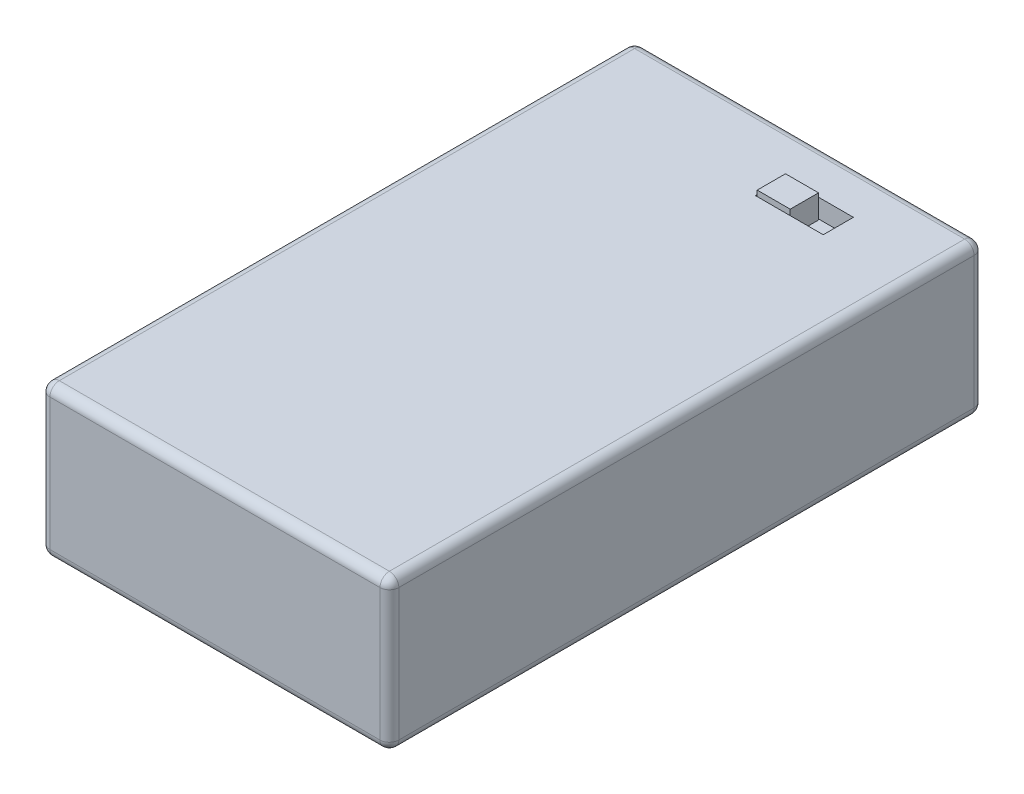
ISO-10303-21;
HEADER;
FILE_DESCRIPTION(('STEP AP214'),'2;1');
FILE_NAME('part.step','',(''),(''),'','','');
FILE_SCHEMA(('AUTOMOTIVE_DESIGN { 1 0 10303 214 1 1 1 1 }'));
ENDSEC;
DATA;
#1=APPLICATION_CONTEXT('core data for automotive mechanical design processes');
#2=APPLICATION_PROTOCOL_DEFINITION('international standard','automotive_design',2000,#1);
#3=PRODUCT_CONTEXT('',#1,'mechanical');
#4=PRODUCT('Part','Part','',(#3));
#5=PRODUCT_RELATED_PRODUCT_CATEGORY('part','',(#4));
#6=PRODUCT_DEFINITION_FORMATION('','',#4);
#7=PRODUCT_DEFINITION_CONTEXT('part definition',#1,'design');
#8=PRODUCT_DEFINITION('design','',#6,#7);
#9=PRODUCT_DEFINITION_SHAPE('','',#8);
#10=(LENGTH_UNIT() NAMED_UNIT(*) SI_UNIT(.MILLI.,.METRE.));
#11=(NAMED_UNIT(*) PLANE_ANGLE_UNIT() SI_UNIT($,.RADIAN.));
#12=(NAMED_UNIT(*) SI_UNIT($,.STERADIAN.) SOLID_ANGLE_UNIT());
#13=UNCERTAINTY_MEASURE_WITH_UNIT(LENGTH_MEASURE(1.E-05),#10,'distance_accuracy_value','');
#14=(GEOMETRIC_REPRESENTATION_CONTEXT(3) GLOBAL_UNCERTAINTY_ASSIGNED_CONTEXT((#13)) GLOBAL_UNIT_ASSIGNED_CONTEXT((#10,
#11,#12)) REPRESENTATION_CONTEXT('',''));
#15=CARTESIAN_POINT('',(0.,0.,0.));
#16=DIRECTION('',(0.,0.,1.));
#17=DIRECTION('',(1.,0.,0.));
#18=AXIS2_PLACEMENT_3D('',#15,#16,#17);
#19=CARTESIAN_POINT('',(-18.5,16.,31.5));
#20=DIRECTION('',(0.,0.,-1.));
#21=DIRECTION('',(-1.,0.,0.));
#22=AXIS2_PLACEMENT_3D('',#19,#20,#21);
#23=PLANE('',#22);
#24=DIRECTION('',(0.,-1.,0.));
#25=VECTOR('',#24,1.);
#26=CARTESIAN_POINT('',(17.5,16.,31.5));
#27=LINE('',#26,#25);
#28=CARTESIAN_POINT('',(17.5,1.,31.5));
#29=VERTEX_POINT('',#28);
#30=CARTESIAN_POINT('',(17.5,15.,31.5));
#31=VERTEX_POINT('',#30);
#32=EDGE_CURVE('E265',#29,#31,#27,.F.);
#33=ORIENTED_EDGE('',*,*,#32,.T.);
#34=DIRECTION('',(1.,0.,0.));
#35=VECTOR('',#34,1.);
#36=CARTESIAN_POINT('',(-18.5,15.,31.5));
#37=LINE('',#36,#35);
#38=CARTESIAN_POINT('',(-17.5,15.,31.5));
#39=VERTEX_POINT('',#38);
#40=EDGE_CURVE('E268',#31,#39,#37,.F.);
#41=ORIENTED_EDGE('',*,*,#40,.T.);
#42=DIRECTION('',(0.,-1.,0.));
#43=VECTOR('',#42,1.);
#44=CARTESIAN_POINT('',(-17.5,0.,31.5));
#45=LINE('',#44,#43);
#46=CARTESIAN_POINT('',(-17.5,1.,31.5));
#47=VERTEX_POINT('',#46);
#48=EDGE_CURVE('E263',#39,#47,#45,.T.);
#49=ORIENTED_EDGE('',*,*,#48,.T.);
#50=DIRECTION('',(1.,0.,0.));
#51=VECTOR('',#50,1.);
#52=CARTESIAN_POINT('',(-18.5,1.,31.5));
#53=LINE('',#52,#51);
#54=EDGE_CURVE('E261',#47,#29,#53,.T.);
#55=ORIENTED_EDGE('',*,*,#54,.T.);
#56=EDGE_LOOP('',(#33,#41,#49,#55));
#57=FACE_BOUND('',#56,.T.);
#58=ADVANCED_FACE('F34',(#57),#23,.F.);
#59=CARTESIAN_POINT('',(18.5,16.,31.5));
#60=DIRECTION('',(-1.,0.,0.));
#61=DIRECTION('',(0.,0.,1.));
#62=AXIS2_PLACEMENT_3D('',#59,#60,#61);
#63=PLANE('',#62);
#64=DIRECTION('',(0.,-1.,0.));
#65=VECTOR('',#64,1.);
#66=CARTESIAN_POINT('',(18.5,16.,30.5));
#67=LINE('',#66,#65);
#68=CARTESIAN_POINT('',(18.5,15.,30.5));
#69=VERTEX_POINT('',#68);
#70=CARTESIAN_POINT('',(18.5,1.,30.5));
#71=VERTEX_POINT('',#70);
#72=EDGE_CURVE('E254',#69,#71,#67,.T.);
#73=ORIENTED_EDGE('',*,*,#72,.T.);
#74=DIRECTION('',(0.,0.,-1.));
#75=VECTOR('',#74,1.);
#76=CARTESIAN_POINT('',(18.5,1.,31.5));
#77=LINE('',#76,#75);
#78=CARTESIAN_POINT('',(18.5,1.,-30.5));
#79=VERTEX_POINT('',#78);
#80=EDGE_CURVE('E259',#71,#79,#77,.T.);
#81=ORIENTED_EDGE('',*,*,#80,.T.);
#82=DIRECTION('',(0.,-1.,0.));
#83=VECTOR('',#82,1.);
#84=CARTESIAN_POINT('',(18.5,16.,-30.5));
#85=LINE('',#84,#83);
#86=CARTESIAN_POINT('',(18.5,15.,-30.5));
#87=VERTEX_POINT('',#86);
#88=EDGE_CURVE('E256',#79,#87,#85,.F.);
#89=ORIENTED_EDGE('',*,*,#88,.T.);
#90=DIRECTION('',(0.,0.,-1.));
#91=VECTOR('',#90,1.);
#92=CARTESIAN_POINT('',(18.5,15.,31.5));
#93=LINE('',#92,#91);
#94=EDGE_CURVE('E252',#87,#69,#93,.F.);
#95=ORIENTED_EDGE('',*,*,#94,.T.);
#96=EDGE_LOOP('',(#73,#81,#89,#95));
#97=FACE_BOUND('',#96,.T.);
#98=ADVANCED_FACE('F439',(#97),#63,.F.);
#99=CARTESIAN_POINT('',(-18.5,16.,-31.5));
#100=DIRECTION('',(0.,0.,-1.));
#101=DIRECTION('',(-1.,0.,0.));
#102=AXIS2_PLACEMENT_3D('',#99,#100,#101);
#103=PLANE('',#102);
#104=CARTESIAN_POINT('',(-11.5,11.,-31.5));
#105=DIRECTION('',(0.,0.,-1.));
#106=DIRECTION('',(-1.,0.,0.));
#107=AXIS2_PLACEMENT_3D('',#104,#105,#106);
#108=CIRCLE('',#107,2.5);
#109=CARTESIAN_POINT('',(-14.,11.,-31.5));
#110=VERTEX_POINT('',#109);
#111=EDGE_CURVE('E200',#110,#110,#108,.T.);
#112=ORIENTED_EDGE('',*,*,#111,.F.);
#113=EDGE_LOOP('',(#112));
#114=FACE_BOUND('',#113,.T.);
#115=DIRECTION('',(0.,-1.,0.));
#116=VECTOR('',#115,1.);
#117=CARTESIAN_POINT('',(17.5,0.,-31.5));
#118=LINE('',#117,#116);
#119=CARTESIAN_POINT('',(17.5,15.,-31.5));
#120=VERTEX_POINT('',#119);
#121=CARTESIAN_POINT('',(17.5,1.,-31.5));
#122=VERTEX_POINT('',#121);
#123=EDGE_CURVE('E247',#120,#122,#118,.T.);
#124=ORIENTED_EDGE('',*,*,#123,.T.);
#125=DIRECTION('',(1.,0.,0.));
#126=VECTOR('',#125,1.);
#127=CARTESIAN_POINT('',(-18.5,1.,-31.5));
#128=LINE('',#127,#126);
#129=CARTESIAN_POINT('',(-17.5,1.,-31.5));
#130=VERTEX_POINT('',#129);
#131=EDGE_CURVE('E250',#122,#130,#128,.F.);
#132=ORIENTED_EDGE('',*,*,#131,.T.);
#133=DIRECTION('',(0.,-1.,0.));
#134=VECTOR('',#133,1.);
#135=CARTESIAN_POINT('',(-17.5,16.,-31.5));
#136=LINE('',#135,#134);
#137=CARTESIAN_POINT('',(-17.5,15.,-31.5));
#138=VERTEX_POINT('',#137);
#139=EDGE_CURVE('E245',#130,#138,#136,.F.);
#140=ORIENTED_EDGE('',*,*,#139,.T.);
#141=DIRECTION('',(1.,0.,0.));
#142=VECTOR('',#141,1.);
#143=CARTESIAN_POINT('',(-18.5,15.,-31.5));
#144=LINE('',#143,#142);
#145=EDGE_CURVE('E243',#138,#120,#144,.T.);
#146=ORIENTED_EDGE('',*,*,#145,.T.);
#147=EDGE_LOOP('',(#124,#132,#140,#146));
#148=FACE_BOUND('',#147,.T.);
#149=ADVANCED_FACE('F444',(#114,#148),#103,.T.);
#150=CARTESIAN_POINT('',(-18.5,16.,31.5));
#151=DIRECTION('',(-1.,0.,0.));
#152=DIRECTION('',(0.,0.,1.));
#153=AXIS2_PLACEMENT_3D('',#150,#151,#152);
#154=PLANE('',#153);
#155=DIRECTION('',(0.,-1.,0.));
#156=VECTOR('',#155,1.);
#157=CARTESIAN_POINT('',(-18.5,16.,-30.5));
#158=LINE('',#157,#156);
#159=CARTESIAN_POINT('',(-18.5,15.,-30.5));
#160=VERTEX_POINT('',#159);
#161=CARTESIAN_POINT('',(-18.5,1.,-30.5));
#162=VERTEX_POINT('',#161);
#163=EDGE_CURVE('E274',#160,#162,#158,.T.);
#164=ORIENTED_EDGE('',*,*,#163,.T.);
#165=DIRECTION('',(0.,0.,-1.));
#166=VECTOR('',#165,1.);
#167=CARTESIAN_POINT('',(-18.5,1.,31.5));
#168=LINE('',#167,#166);
#169=CARTESIAN_POINT('',(-18.5,1.,30.5));
#170=VERTEX_POINT('',#169);
#171=EDGE_CURVE('E277',#162,#170,#168,.F.);
#172=ORIENTED_EDGE('',*,*,#171,.T.);
#173=DIRECTION('',(0.,-1.,0.));
#174=VECTOR('',#173,1.);
#175=CARTESIAN_POINT('',(-18.5,16.,30.5));
#176=LINE('',#175,#174);
#177=CARTESIAN_POINT('',(-18.5,15.,30.5));
#178=VERTEX_POINT('',#177);
#179=EDGE_CURVE('E272',#170,#178,#176,.F.);
#180=ORIENTED_EDGE('',*,*,#179,.T.);
#181=DIRECTION('',(0.,0.,-1.));
#182=VECTOR('',#181,1.);
#183=CARTESIAN_POINT('',(-18.5,15.,31.5));
#184=LINE('',#183,#182);
#185=EDGE_CURVE('E270',#178,#160,#184,.T.);
#186=ORIENTED_EDGE('',*,*,#185,.T.);
#187=EDGE_LOOP('',(#164,#172,#180,#186));
#188=FACE_BOUND('',#187,.T.);
#189=ADVANCED_FACE('F384',(#188),#154,.T.);
#190=CARTESIAN_POINT('',(0.,16.,0.));
#191=DIRECTION('',(0.,1.,0.));
#192=DIRECTION('',(0.,0.,1.));
#193=AXIS2_PLACEMENT_3D('',#190,#191,#192);
#194=PLANE('',#193);
#195=DIRECTION('',(0.,0.,-1.));
#196=VECTOR('',#195,1.);
#197=CARTESIAN_POINT('',(9.59999999999999,16.,0.));
#198=LINE('',#197,#196);
#199=CARTESIAN_POINT('',(9.59999999999999,16.,-23.4));
#200=VERTEX_POINT('',#199);
#201=CARTESIAN_POINT('',(9.59999999999999,16.,-26.6));
#202=VERTEX_POINT('',#201);
#203=EDGE_CURVE('E59',#200,#202,#198,.T.);
#204=ORIENTED_EDGE('',*,*,#203,.F.);
#205=DIRECTION('',(-1.,0.,0.));
#206=VECTOR('',#205,1.);
#207=CARTESIAN_POINT('',(0.,16.,-23.4));
#208=LINE('',#207,#206);
#209=CARTESIAN_POINT('',(2.4,16.,-23.4));
#210=VERTEX_POINT('',#209);
#211=EDGE_CURVE('E218',#200,#210,#208,.T.);
#212=ORIENTED_EDGE('',*,*,#211,.T.);
#213=DIRECTION('',(0.,0.,-1.));
#214=VECTOR('',#213,1.);
#215=CARTESIAN_POINT('',(2.4,16.,0.));
#216=LINE('',#215,#214);
#217=CARTESIAN_POINT('',(2.4,16.,-26.6));
#218=VERTEX_POINT('',#217);
#219=EDGE_CURVE('E230',#210,#218,#216,.T.);
#220=ORIENTED_EDGE('',*,*,#219,.T.);
#221=DIRECTION('',(-1.,0.,0.));
#222=VECTOR('',#221,1.);
#223=CARTESIAN_POINT('',(0.,16.,-26.6));
#224=LINE('',#223,#222);
#225=EDGE_CURVE('E227',#202,#218,#224,.T.);
#226=ORIENTED_EDGE('',*,*,#225,.F.);
#227=EDGE_LOOP('',(#204,#212,#220,#226));
#228=FACE_BOUND('',#227,.T.);
#229=DIRECTION('',(1.,0.,0.));
#230=VECTOR('',#229,1.);
#231=CARTESIAN_POINT('',(18.5,16.,30.5));
#232=LINE('',#231,#230);
#233=CARTESIAN_POINT('',(-17.5,16.,30.5));
#234=VERTEX_POINT('',#233);
#235=CARTESIAN_POINT('',(17.5,16.,30.5));
#236=VERTEX_POINT('',#235);
#237=EDGE_CURVE('E290',#234,#236,#232,.T.);
#238=ORIENTED_EDGE('',*,*,#237,.T.);
#239=DIRECTION('',(0.,0.,-1.));
#240=VECTOR('',#239,1.);
#241=CARTESIAN_POINT('',(17.5,16.,-31.5));
#242=LINE('',#241,#240);
#243=CARTESIAN_POINT('',(17.5,16.,-30.5));
#244=VERTEX_POINT('',#243);
#245=EDGE_CURVE('E11',#236,#244,#242,.T.);
#246=ORIENTED_EDGE('',*,*,#245,.T.);
#247=DIRECTION('',(1.,0.,0.));
#248=VECTOR('',#247,1.);
#249=CARTESIAN_POINT('',(0.,16.,-30.5));
#250=LINE('',#249,#248);
#251=CARTESIAN_POINT('',(-17.5,16.,-30.5));
#252=VERTEX_POINT('',#251);
#253=EDGE_CURVE('E43',#244,#252,#250,.F.);
#254=ORIENTED_EDGE('',*,*,#253,.T.);
#255=DIRECTION('',(0.,0.,-1.));
#256=VECTOR('',#255,1.);
#257=CARTESIAN_POINT('',(-17.5,16.,0.));
#258=LINE('',#257,#256);
#259=EDGE_CURVE('E288',#252,#234,#258,.F.);
#260=ORIENTED_EDGE('',*,*,#259,.T.);
#261=EDGE_LOOP('',(#238,#246,#254,#260));
#262=FACE_BOUND('',#261,.T.);
#263=ADVANCED_FACE('F375',(#228,#262),#194,.T.);
#264=CARTESIAN_POINT('',(0.,0.,0.));
#265=DIRECTION('',(0.,1.,0.));
#266=DIRECTION('',(0.,0.,1.));
#267=AXIS2_PLACEMENT_3D('',#264,#265,#266);
#268=PLANE('',#267);
#269=DIRECTION('',(1.,0.,0.));
#270=VECTOR('',#269,1.);
#271=CARTESIAN_POINT('',(18.5,0.,-30.5));
#272=LINE('',#271,#270);
#273=CARTESIAN_POINT('',(-17.5,0.,-30.5));
#274=VERTEX_POINT('',#273);
#275=CARTESIAN_POINT('',(17.5,0.,-30.5));
#276=VERTEX_POINT('',#275);
#277=EDGE_CURVE('E283',#274,#276,#272,.T.);
#278=ORIENTED_EDGE('',*,*,#277,.T.);
#279=DIRECTION('',(0.,0.,-1.));
#280=VECTOR('',#279,1.);
#281=CARTESIAN_POINT('',(17.5,0.,0.));
#282=LINE('',#281,#280);
#283=CARTESIAN_POINT('',(17.5,0.,30.5));
#284=VERTEX_POINT('',#283);
#285=EDGE_CURVE('E286',#276,#284,#282,.F.);
#286=ORIENTED_EDGE('',*,*,#285,.T.);
#287=DIRECTION('',(1.,0.,0.));
#288=VECTOR('',#287,1.);
#289=CARTESIAN_POINT('',(0.,0.,30.5));
#290=LINE('',#289,#288);
#291=CARTESIAN_POINT('',(-17.5,0.,30.5));
#292=VERTEX_POINT('',#291);
#293=EDGE_CURVE('E281',#284,#292,#290,.F.);
#294=ORIENTED_EDGE('',*,*,#293,.T.);
#295=DIRECTION('',(0.,0.,-1.));
#296=VECTOR('',#295,1.);
#297=CARTESIAN_POINT('',(-17.5,0.,-31.5));
#298=LINE('',#297,#296);
#299=EDGE_CURVE('E279',#292,#274,#298,.T.);
#300=ORIENTED_EDGE('',*,*,#299,.T.);
#301=EDGE_LOOP('',(#278,#286,#294,#300));
#302=FACE_BOUND('',#301,.T.);
#303=ADVANCED_FACE('F495',(#302),#268,.F.);
#304=CARTESIAN_POINT('',(-17.5,16.,30.5));
#305=DIRECTION('',(0.,1.,0.));
#306=DIRECTION('',(0.,0.,1.));
#307=AXIS2_PLACEMENT_3D('',#304,#305,#306);
#308=CYLINDRICAL_SURFACE('',#307,1.);
#309=CARTESIAN_POINT('',(-17.5,15.,30.5));
#310=DIRECTION('',(0.,1.,0.));
#311=DIRECTION('',(0.,0.,1.));
#312=AXIS2_PLACEMENT_3D('',#309,#310,#311);
#313=CIRCLE('',#312,1.);
#314=EDGE_CURVE('E38',#178,#39,#313,.T.);
#315=ORIENTED_EDGE('',*,*,#314,.F.);
#316=ORIENTED_EDGE('',*,*,#179,.F.);
#317=CARTESIAN_POINT('',(-17.5,1.,30.5));
#318=DIRECTION('',(0.,-1.,0.));
#319=DIRECTION('',(1.,0.,0.));
#320=AXIS2_PLACEMENT_3D('',#317,#318,#319);
#321=CIRCLE('',#320,1.);
#322=EDGE_CURVE('E352',#47,#170,#321,.T.);
#323=ORIENTED_EDGE('',*,*,#322,.F.);
#324=ORIENTED_EDGE('',*,*,#48,.F.);
#325=EDGE_LOOP('',(#315,#316,#323,#324));
#326=FACE_BOUND('',#325,.T.);
#327=ADVANCED_FACE('F36',(#326),#308,.T.);
#328=CARTESIAN_POINT('',(-17.5,15.,30.5));
#329=DIRECTION('',(0.,0.,1.));
#330=DIRECTION('',(1.,0.,0.));
#331=AXIS2_PLACEMENT_3D('',#328,#329,#330);
#332=SPHERICAL_SURFACE('',#331,1.);
#333=CARTESIAN_POINT('',(-17.5,15.,30.5));
#334=DIRECTION('',(0.,0.,1.));
#335=DIRECTION('',(1.,0.,0.));
#336=AXIS2_PLACEMENT_3D('',#333,#334,#335);
#337=CIRCLE('',#336,1.);
#338=EDGE_CURVE('E347',#178,#234,#337,.F.);
#339=ORIENTED_EDGE('',*,*,#338,.F.);
#340=ORIENTED_EDGE('',*,*,#314,.T.);
#341=CARTESIAN_POINT('',(-17.5,15.,30.5));
#342=DIRECTION('',(-1.,0.,0.));
#343=DIRECTION('',(0.,0.,1.));
#344=AXIS2_PLACEMENT_3D('',#341,#342,#343);
#345=CIRCLE('',#344,1.);
#346=EDGE_CURVE('E350',#234,#39,#345,.F.);
#347=ORIENTED_EDGE('',*,*,#346,.F.);
#348=EDGE_LOOP('',(#339,#340,#347));
#349=FACE_BOUND('',#348,.T.);
#350=ADVANCED_FACE('F363',(#349),#332,.T.);
#351=CARTESIAN_POINT('',(-17.5,1.,30.5));
#352=DIRECTION('',(-1.,0.,0.));
#353=DIRECTION('',(0.,0.,1.));
#354=AXIS2_PLACEMENT_3D('',#351,#352,#353);
#355=SPHERICAL_SURFACE('',#354,1.);
#356=CARTESIAN_POINT('',(-17.5,1.,30.5));
#357=DIRECTION('',(-1.,0.,0.));
#358=DIRECTION('',(0.,0.,1.));
#359=AXIS2_PLACEMENT_3D('',#356,#357,#358);
#360=CIRCLE('',#359,1.);
#361=EDGE_CURVE('E341',#47,#292,#360,.F.);
#362=ORIENTED_EDGE('',*,*,#361,.F.);
#363=ORIENTED_EDGE('',*,*,#322,.T.);
#364=CARTESIAN_POINT('',(-17.5,1.,30.5));
#365=DIRECTION('',(0.,0.,1.));
#366=DIRECTION('',(1.,0.,0.));
#367=AXIS2_PLACEMENT_3D('',#364,#365,#366);
#368=CIRCLE('',#367,1.);
#369=EDGE_CURVE('E344',#292,#170,#368,.F.);
#370=ORIENTED_EDGE('',*,*,#369,.F.);
#371=EDGE_LOOP('',(#362,#363,#370));
#372=FACE_BOUND('',#371,.T.);
#373=ADVANCED_FACE('F399',(#372),#355,.T.);
#374=CARTESIAN_POINT('',(0.,15.,30.5));
#375=DIRECTION('',(-1.,0.,0.));
#376=DIRECTION('',(0.,0.,1.));
#377=AXIS2_PLACEMENT_3D('',#374,#375,#376);
#378=CYLINDRICAL_SURFACE('',#377,1.);
#379=ORIENTED_EDGE('',*,*,#346,.T.);
#380=ORIENTED_EDGE('',*,*,#40,.F.);
#381=CARTESIAN_POINT('',(17.5,15.,30.5));
#382=DIRECTION('',(1.,0.,0.));
#383=DIRECTION('',(0.,0.,-1.));
#384=AXIS2_PLACEMENT_3D('',#381,#382,#383);
#385=CIRCLE('',#384,1.);
#386=EDGE_CURVE('E336',#236,#31,#385,.T.);
#387=ORIENTED_EDGE('',*,*,#386,.F.);
#388=ORIENTED_EDGE('',*,*,#237,.F.);
#389=EDGE_LOOP('',(#379,#380,#387,#388));
#390=FACE_BOUND('',#389,.T.);
#391=ADVANCED_FACE('F371',(#390),#378,.T.);
#392=CARTESIAN_POINT('',(-17.5,15.,31.5));
#393=DIRECTION('',(0.,0.,-1.));
#394=DIRECTION('',(-1.,0.,0.));
#395=AXIS2_PLACEMENT_3D('',#392,#393,#394);
#396=CYLINDRICAL_SURFACE('',#395,1.);
#397=ORIENTED_EDGE('',*,*,#338,.T.);
#398=ORIENTED_EDGE('',*,*,#259,.F.);
#399=CARTESIAN_POINT('',(-17.5,15.,-30.5));
#400=DIRECTION('',(0.,0.,-1.));
#401=DIRECTION('',(-1.,0.,0.));
#402=AXIS2_PLACEMENT_3D('',#399,#400,#401);
#403=CIRCLE('',#402,1.);
#404=EDGE_CURVE('E333',#160,#252,#403,.T.);
#405=ORIENTED_EDGE('',*,*,#404,.F.);
#406=ORIENTED_EDGE('',*,*,#185,.F.);
#407=EDGE_LOOP('',(#397,#398,#405,#406));
#408=FACE_BOUND('',#407,.T.);
#409=ADVANCED_FACE('F381',(#408),#396,.T.);
#410=CARTESIAN_POINT('',(-17.5,16.,-30.5));
#411=DIRECTION('',(0.,-1.,0.));
#412=DIRECTION('',(0.,0.,-1.));
#413=AXIS2_PLACEMENT_3D('',#410,#411,#412);
#414=CYLINDRICAL_SURFACE('',#413,1.);
#415=CARTESIAN_POINT('',(-17.5,1.,-30.5));
#416=DIRECTION('',(0.,-1.,0.));
#417=DIRECTION('',(0.,0.,-1.));
#418=AXIS2_PLACEMENT_3D('',#415,#416,#417);
#419=CIRCLE('',#418,1.);
#420=EDGE_CURVE('E327',#162,#130,#419,.T.);
#421=ORIENTED_EDGE('',*,*,#420,.F.);
#422=ORIENTED_EDGE('',*,*,#163,.F.);
#423=CARTESIAN_POINT('',(-17.5,15.,-30.5));
#424=DIRECTION('',(0.,1.,0.));
#425=DIRECTION('',(0.,0.,1.));
#426=AXIS2_PLACEMENT_3D('',#423,#424,#425);
#427=CIRCLE('',#426,1.);
#428=EDGE_CURVE('E330',#138,#160,#427,.T.);
#429=ORIENTED_EDGE('',*,*,#428,.F.);
#430=ORIENTED_EDGE('',*,*,#139,.F.);
#431=EDGE_LOOP('',(#421,#422,#429,#430));
#432=FACE_BOUND('',#431,.T.);
#433=ADVANCED_FACE('F388',(#432),#414,.T.);
#434=CARTESIAN_POINT('',(-17.5,1.,0.));
#435=DIRECTION('',(0.,0.,1.));
#436=DIRECTION('',(1.,0.,0.));
#437=AXIS2_PLACEMENT_3D('',#434,#435,#436);
#438=CYLINDRICAL_SURFACE('',#437,1.);
#439=ORIENTED_EDGE('',*,*,#369,.T.);
#440=ORIENTED_EDGE('',*,*,#171,.F.);
#441=CARTESIAN_POINT('',(-17.5,1.,-30.5));
#442=DIRECTION('',(0.,0.,-1.));
#443=DIRECTION('',(-1.,0.,0.));
#444=AXIS2_PLACEMENT_3D('',#441,#442,#443);
#445=CIRCLE('',#444,1.);
#446=EDGE_CURVE('E325',#274,#162,#445,.T.);
#447=ORIENTED_EDGE('',*,*,#446,.F.);
#448=ORIENTED_EDGE('',*,*,#299,.F.);
#449=EDGE_LOOP('',(#439,#440,#447,#448));
#450=FACE_BOUND('',#449,.T.);
#451=ADVANCED_FACE('F396',(#450),#438,.T.);
#452=CARTESIAN_POINT('',(-18.5,1.,30.5));
#453=DIRECTION('',(1.,0.,0.));
#454=DIRECTION('',(0.,0.,-1.));
#455=AXIS2_PLACEMENT_3D('',#452,#453,#454);
#456=CYLINDRICAL_SURFACE('',#455,1.);
#457=ORIENTED_EDGE('',*,*,#361,.T.);
#458=ORIENTED_EDGE('',*,*,#293,.F.);
#459=CARTESIAN_POINT('',(17.5,1.,30.5));
#460=DIRECTION('',(1.,0.,0.));
#461=DIRECTION('',(0.,0.,-1.));
#462=AXIS2_PLACEMENT_3D('',#459,#460,#461);
#463=CIRCLE('',#462,1.);
#464=EDGE_CURVE('E322',#29,#284,#463,.T.);
#465=ORIENTED_EDGE('',*,*,#464,.F.);
#466=ORIENTED_EDGE('',*,*,#54,.F.);
#467=EDGE_LOOP('',(#457,#458,#465,#466));
#468=FACE_BOUND('',#467,.T.);
#469=ADVANCED_FACE('F403',(#468),#456,.T.);
#470=CARTESIAN_POINT('',(17.5,16.,30.5));
#471=DIRECTION('',(0.,-1.,0.));
#472=DIRECTION('',(0.,0.,-1.));
#473=AXIS2_PLACEMENT_3D('',#470,#471,#472);
#474=CYLINDRICAL_SURFACE('',#473,1.);
#475=CARTESIAN_POINT('',(17.5,15.,30.5));
#476=DIRECTION('',(0.,1.,0.));
#477=DIRECTION('',(0.,0.,1.));
#478=AXIS2_PLACEMENT_3D('',#475,#476,#477);
#479=CIRCLE('',#478,1.);
#480=EDGE_CURVE('E338',#31,#69,#479,.T.);
#481=ORIENTED_EDGE('',*,*,#480,.F.);
#482=ORIENTED_EDGE('',*,*,#32,.F.);
#483=CARTESIAN_POINT('',(17.5,1.,30.5));
#484=DIRECTION('',(0.,-1.,0.));
#485=DIRECTION('',(0.,0.,-1.));
#486=AXIS2_PLACEMENT_3D('',#483,#484,#485);
#487=CIRCLE('',#486,1.);
#488=EDGE_CURVE('E319',#71,#29,#487,.T.);
#489=ORIENTED_EDGE('',*,*,#488,.F.);
#490=ORIENTED_EDGE('',*,*,#72,.F.);
#491=EDGE_LOOP('',(#481,#482,#489,#490));
#492=FACE_BOUND('',#491,.T.);
#493=ADVANCED_FACE('F409',(#492),#474,.T.);
#494=CARTESIAN_POINT('',(17.5,15.,30.5));
#495=DIRECTION('',(0.,0.,1.));
#496=DIRECTION('',(1.,0.,0.));
#497=AXIS2_PLACEMENT_3D('',#494,#495,#496);
#498=SPHERICAL_SURFACE('',#497,1.);
#499=ORIENTED_EDGE('',*,*,#386,.T.);
#500=ORIENTED_EDGE('',*,*,#480,.T.);
#501=CARTESIAN_POINT('',(17.5,15.,30.5));
#502=DIRECTION('',(0.,0.,1.));
#503=DIRECTION('',(1.,0.,0.));
#504=AXIS2_PLACEMENT_3D('',#501,#502,#503);
#505=CIRCLE('',#504,1.);
#506=EDGE_CURVE('E316',#236,#69,#505,.F.);
#507=ORIENTED_EDGE('',*,*,#506,.F.);
#508=EDGE_LOOP('',(#499,#500,#507));
#509=FACE_BOUND('',#508,.T.);
#510=ADVANCED_FACE('F413',(#509),#498,.T.);
#511=CARTESIAN_POINT('',(-17.5,15.,-30.5));
#512=DIRECTION('',(-1.,0.,0.));
#513=DIRECTION('',(0.,0.,1.));
#514=AXIS2_PLACEMENT_3D('',#511,#512,#513);
#515=SPHERICAL_SURFACE('',#514,1.);
#516=ORIENTED_EDGE('',*,*,#428,.T.);
#517=ORIENTED_EDGE('',*,*,#404,.T.);
#518=CARTESIAN_POINT('',(-17.5,15.,-30.5));
#519=DIRECTION('',(-1.,0.,0.));
#520=DIRECTION('',(0.,0.,1.));
#521=AXIS2_PLACEMENT_3D('',#518,#519,#520);
#522=CIRCLE('',#521,1.);
#523=EDGE_CURVE('E314',#138,#252,#522,.F.);
#524=ORIENTED_EDGE('',*,*,#523,.F.);
#525=EDGE_LOOP('',(#516,#517,#524));
#526=FACE_BOUND('',#525,.T.);
#527=ADVANCED_FACE('F427',(#526),#515,.T.);
#528=CARTESIAN_POINT('',(-17.5,1.,-30.5));
#529=DIRECTION('',(-1.,0.,0.));
#530=DIRECTION('',(0.,0.,1.));
#531=AXIS2_PLACEMENT_3D('',#528,#529,#530);
#532=SPHERICAL_SURFACE('',#531,1.);
#533=ORIENTED_EDGE('',*,*,#446,.T.);
#534=ORIENTED_EDGE('',*,*,#420,.T.);
#535=CARTESIAN_POINT('',(-17.5,1.,-30.5));
#536=DIRECTION('',(-1.,0.,0.));
#537=DIRECTION('',(0.,0.,1.));
#538=AXIS2_PLACEMENT_3D('',#535,#536,#537);
#539=CIRCLE('',#538,1.);
#540=EDGE_CURVE('E311',#274,#130,#539,.F.);
#541=ORIENTED_EDGE('',*,*,#540,.F.);
#542=EDGE_LOOP('',(#533,#534,#541));
#543=FACE_BOUND('',#542,.T.);
#544=ADVANCED_FACE('F429',(#543),#532,.T.);
#545=CARTESIAN_POINT('',(17.5,1.,30.5));
#546=DIRECTION('',(0.,0.,1.));
#547=DIRECTION('',(0.,-1.,0.));
#548=AXIS2_PLACEMENT_3D('',#545,#546,#547);
#549=SPHERICAL_SURFACE('',#548,1.);
#550=ORIENTED_EDGE('',*,*,#488,.T.);
#551=ORIENTED_EDGE('',*,*,#464,.T.);
#552=CARTESIAN_POINT('',(17.5,1.,30.5));
#553=DIRECTION('',(0.,0.,1.));
#554=DIRECTION('',(1.,0.,0.));
#555=AXIS2_PLACEMENT_3D('',#552,#553,#554);
#556=CIRCLE('',#555,1.);
#557=EDGE_CURVE('E308',#71,#284,#556,.F.);
#558=ORIENTED_EDGE('',*,*,#557,.F.);
#559=EDGE_LOOP('',(#550,#551,#558));
#560=FACE_BOUND('',#559,.T.);
#561=ADVANCED_FACE('F435',(#560),#549,.T.);
#562=CARTESIAN_POINT('',(17.5,15.,0.));
#563=DIRECTION('',(0.,0.,1.));
#564=DIRECTION('',(1.,0.,0.));
#565=AXIS2_PLACEMENT_3D('',#562,#563,#564);
#566=CYLINDRICAL_SURFACE('',#565,1.);
#567=ORIENTED_EDGE('',*,*,#506,.T.);
#568=ORIENTED_EDGE('',*,*,#94,.F.);
#569=CARTESIAN_POINT('',(17.5,15.,-30.5));
#570=DIRECTION('',(0.,0.,-1.));
#571=DIRECTION('',(-1.,0.,0.));
#572=AXIS2_PLACEMENT_3D('',#569,#570,#571);
#573=CIRCLE('',#572,1.);
#574=EDGE_CURVE('E305',#244,#87,#573,.T.);
#575=ORIENTED_EDGE('',*,*,#574,.F.);
#576=ORIENTED_EDGE('',*,*,#245,.F.);
#577=EDGE_LOOP('',(#567,#568,#575,#576));
#578=FACE_BOUND('',#577,.T.);
#579=ADVANCED_FACE('F416',(#578),#566,.T.);
#580=CARTESIAN_POINT('',(-18.5,15.,-30.5));
#581=DIRECTION('',(1.,0.,0.));
#582=DIRECTION('',(0.,0.,-1.));
#583=AXIS2_PLACEMENT_3D('',#580,#581,#582);
#584=CYLINDRICAL_SURFACE('',#583,1.);
#585=ORIENTED_EDGE('',*,*,#523,.T.);
#586=ORIENTED_EDGE('',*,*,#253,.F.);
#587=CARTESIAN_POINT('',(17.5,15.,-30.5));
#588=DIRECTION('',(1.,0.,0.));
#589=DIRECTION('',(0.,0.,-1.));
#590=AXIS2_PLACEMENT_3D('',#587,#588,#589);
#591=CIRCLE('',#590,1.);
#592=EDGE_CURVE('E302',#120,#244,#591,.T.);
#593=ORIENTED_EDGE('',*,*,#592,.F.);
#594=ORIENTED_EDGE('',*,*,#145,.F.);
#595=EDGE_LOOP('',(#585,#586,#593,#594));
#596=FACE_BOUND('',#595,.T.);
#597=ADVANCED_FACE('F425',(#596),#584,.T.);
#598=CARTESIAN_POINT('',(0.,1.,-30.5));
#599=DIRECTION('',(-1.,0.,0.));
#600=DIRECTION('',(0.,0.,1.));
#601=AXIS2_PLACEMENT_3D('',#598,#599,#600);
#602=CYLINDRICAL_SURFACE('',#601,1.);
#603=ORIENTED_EDGE('',*,*,#540,.T.);
#604=ORIENTED_EDGE('',*,*,#131,.F.);
#605=CARTESIAN_POINT('',(17.5,1.,-30.5));
#606=DIRECTION('',(1.,0.,0.));
#607=DIRECTION('',(0.,0.,-1.));
#608=AXIS2_PLACEMENT_3D('',#605,#606,#607);
#609=CIRCLE('',#608,1.);
#610=EDGE_CURVE('E299',#276,#122,#609,.T.);
#611=ORIENTED_EDGE('',*,*,#610,.F.);
#612=ORIENTED_EDGE('',*,*,#277,.F.);
#613=EDGE_LOOP('',(#603,#604,#611,#612));
#614=FACE_BOUND('',#613,.T.);
#615=ADVANCED_FACE('F463',(#614),#602,.T.);
#616=CARTESIAN_POINT('',(17.5,1.,31.5));
#617=DIRECTION('',(0.,0.,-1.));
#618=DIRECTION('',(-1.,0.,0.));
#619=AXIS2_PLACEMENT_3D('',#616,#617,#618);
#620=CYLINDRICAL_SURFACE('',#619,1.);
#621=ORIENTED_EDGE('',*,*,#557,.T.);
#622=ORIENTED_EDGE('',*,*,#285,.F.);
#623=CARTESIAN_POINT('',(17.5,1.,-30.5));
#624=DIRECTION('',(0.,0.,-1.));
#625=DIRECTION('',(-1.,0.,0.));
#626=AXIS2_PLACEMENT_3D('',#623,#624,#625);
#627=CIRCLE('',#626,1.);
#628=EDGE_CURVE('E297',#79,#276,#627,.T.);
#629=ORIENTED_EDGE('',*,*,#628,.F.);
#630=ORIENTED_EDGE('',*,*,#80,.F.);
#631=EDGE_LOOP('',(#621,#622,#629,#630));
#632=FACE_BOUND('',#631,.T.);
#633=ADVANCED_FACE('F460',(#632),#620,.T.);
#634=CARTESIAN_POINT('',(17.5,15.,-30.5));
#635=DIRECTION('',(0.,1.,0.));
#636=DIRECTION('',(0.,0.,1.));
#637=AXIS2_PLACEMENT_3D('',#634,#635,#636);
#638=SPHERICAL_SURFACE('',#637,1.);
#639=ORIENTED_EDGE('',*,*,#592,.T.);
#640=ORIENTED_EDGE('',*,*,#574,.T.);
#641=CARTESIAN_POINT('',(17.5,15.,-30.5));
#642=DIRECTION('',(0.,1.,0.));
#643=DIRECTION('',(0.,0.,1.));
#644=AXIS2_PLACEMENT_3D('',#641,#642,#643);
#645=CIRCLE('',#644,1.);
#646=EDGE_CURVE('E295',#120,#87,#645,.F.);
#647=ORIENTED_EDGE('',*,*,#646,.F.);
#648=EDGE_LOOP('',(#639,#640,#647));
#649=FACE_BOUND('',#648,.T.);
#650=ADVANCED_FACE('F421',(#649),#638,.T.);
#651=CARTESIAN_POINT('',(17.5,1.,-30.5));
#652=DIRECTION('',(0.,-1.,0.));
#653=DIRECTION('',(0.,0.,-1.));
#654=AXIS2_PLACEMENT_3D('',#651,#652,#653);
#655=SPHERICAL_SURFACE('',#654,1.);
#656=ORIENTED_EDGE('',*,*,#628,.T.);
#657=ORIENTED_EDGE('',*,*,#610,.T.);
#658=CARTESIAN_POINT('',(17.5,1.,-30.5));
#659=DIRECTION('',(0.,-1.,0.));
#660=DIRECTION('',(1.,0.,0.));
#661=AXIS2_PLACEMENT_3D('',#658,#659,#660);
#662=CIRCLE('',#661,1.);
#663=EDGE_CURVE('E237',#79,#122,#662,.F.);
#664=ORIENTED_EDGE('',*,*,#663,.F.);
#665=EDGE_LOOP('',(#656,#657,#664));
#666=FACE_BOUND('',#665,.T.);
#667=ADVANCED_FACE('F453',(#666),#655,.T.);
#668=CARTESIAN_POINT('',(17.5,16.,-30.5));
#669=DIRECTION('',(0.,1.,0.));
#670=DIRECTION('',(0.,0.,1.));
#671=AXIS2_PLACEMENT_3D('',#668,#669,#670);
#672=CYLINDRICAL_SURFACE('',#671,1.);
#673=ORIENTED_EDGE('',*,*,#646,.T.);
#674=ORIENTED_EDGE('',*,*,#88,.F.);
#675=ORIENTED_EDGE('',*,*,#663,.T.);
#676=ORIENTED_EDGE('',*,*,#123,.F.);
#677=EDGE_LOOP('',(#673,#674,#675,#676));
#678=FACE_BOUND('',#677,.T.);
#679=ADVANCED_FACE('F449',(#678),#672,.T.);
#680=CARTESIAN_POINT('',(9.59999999999999,14.,0.));
#681=DIRECTION('',(1.,0.,0.));
#682=DIRECTION('',(0.,0.,-1.));
#683=AXIS2_PLACEMENT_3D('',#680,#681,#682);
#684=PLANE('',#683);
#685=ORIENTED_EDGE('',*,*,#203,.T.);
#686=DIRECTION('',(0.,1.,0.));
#687=VECTOR('',#686,1.);
#688=CARTESIAN_POINT('',(9.59999999999999,14.,-26.6));
#689=LINE('',#688,#687);
#690=CARTESIAN_POINT('',(9.59999999999999,14.,-26.6));
#691=VERTEX_POINT('',#690);
#692=EDGE_CURVE('E225',#691,#202,#689,.T.);
#693=ORIENTED_EDGE('',*,*,#692,.F.);
#694=DIRECTION('',(0.,0.,-1.));
#695=VECTOR('',#694,1.);
#696=CARTESIAN_POINT('',(9.59999999999999,14.,0.));
#697=LINE('',#696,#695);
#698=CARTESIAN_POINT('',(9.59999999999999,14.,-23.4));
#699=VERTEX_POINT('',#698);
#700=EDGE_CURVE('E214',#699,#691,#697,.T.);
#701=ORIENTED_EDGE('',*,*,#700,.F.);
#702=DIRECTION('',(0.,1.,0.));
#703=VECTOR('',#702,1.);
#704=CARTESIAN_POINT('',(9.59999999999999,14.,-23.4));
#705=LINE('',#704,#703);
#706=EDGE_CURVE('E235',#699,#200,#705,.T.);
#707=ORIENTED_EDGE('',*,*,#706,.T.);
#708=EDGE_LOOP('',(#685,#693,#701,#707));
#709=FACE_BOUND('',#708,.T.);
#710=ADVANCED_FACE('F452',(#709),#684,.F.);
#711=CARTESIAN_POINT('',(0.,14.,-23.4));
#712=DIRECTION('',(0.,0.,-1.));
#713=DIRECTION('',(-1.,0.,0.));
#714=AXIS2_PLACEMENT_3D('',#711,#712,#713);
#715=PLANE('',#714);
#716=ORIENTED_EDGE('',*,*,#211,.F.);
#717=ORIENTED_EDGE('',*,*,#706,.F.);
#718=DIRECTION('',(-1.,0.,0.));
#719=VECTOR('',#718,1.);
#720=CARTESIAN_POINT('',(0.,14.,-23.4));
#721=LINE('',#720,#719);
#722=CARTESIAN_POINT('',(2.4,14.,-23.4));
#723=VERTEX_POINT('',#722);
#724=EDGE_CURVE('E223',#699,#723,#721,.T.);
#725=ORIENTED_EDGE('',*,*,#724,.T.);
#726=DIRECTION('',(0.,1.,0.));
#727=VECTOR('',#726,1.);
#728=CARTESIAN_POINT('',(2.4,14.,-23.4));
#729=LINE('',#728,#727);
#730=EDGE_CURVE('E238',#723,#210,#729,.T.);
#731=ORIENTED_EDGE('',*,*,#730,.T.);
#732=EDGE_LOOP('',(#716,#717,#725,#731));
#733=FACE_BOUND('',#732,.T.);
#734=ADVANCED_FACE('F504',(#733),#715,.T.);
#735=CARTESIAN_POINT('',(2.4,14.,0.));
#736=DIRECTION('',(1.,0.,0.));
#737=DIRECTION('',(0.,0.,-1.));
#738=AXIS2_PLACEMENT_3D('',#735,#736,#737);
#739=PLANE('',#738);
#740=ORIENTED_EDGE('',*,*,#219,.F.);
#741=ORIENTED_EDGE('',*,*,#730,.F.);
#742=DIRECTION('',(0.,0.,-1.));
#743=VECTOR('',#742,1.);
#744=CARTESIAN_POINT('',(2.4,14.,0.));
#745=LINE('',#744,#743);
#746=CARTESIAN_POINT('',(2.4,14.,-26.6));
#747=VERTEX_POINT('',#746);
#748=EDGE_CURVE('E221',#723,#747,#745,.T.);
#749=ORIENTED_EDGE('',*,*,#748,.T.);
#750=DIRECTION('',(0.,1.,0.));
#751=VECTOR('',#750,1.);
#752=CARTESIAN_POINT('',(2.4,14.,-26.6));
#753=LINE('',#752,#751);
#754=EDGE_CURVE('E240',#747,#218,#753,.T.);
#755=ORIENTED_EDGE('',*,*,#754,.T.);
#756=EDGE_LOOP('',(#740,#741,#749,#755));
#757=FACE_BOUND('',#756,.T.);
#758=ADVANCED_FACE('F509',(#757),#739,.T.);
#759=CARTESIAN_POINT('',(0.,14.,-26.6));
#760=DIRECTION('',(0.,0.,-1.));
#761=DIRECTION('',(-1.,0.,0.));
#762=AXIS2_PLACEMENT_3D('',#759,#760,#761);
#763=PLANE('',#762);
#764=ORIENTED_EDGE('',*,*,#225,.T.);
#765=ORIENTED_EDGE('',*,*,#754,.F.);
#766=DIRECTION('',(-1.,0.,0.));
#767=VECTOR('',#766,1.);
#768=CARTESIAN_POINT('',(0.,14.,-26.6));
#769=LINE('',#768,#767);
#770=EDGE_CURVE('E217',#691,#747,#769,.T.);
#771=ORIENTED_EDGE('',*,*,#770,.F.);
#772=ORIENTED_EDGE('',*,*,#692,.T.);
#773=EDGE_LOOP('',(#764,#765,#771,#772));
#774=FACE_BOUND('',#773,.T.);
#775=ADVANCED_FACE('F505',(#774),#763,.F.);
#776=CARTESIAN_POINT('',(0.,14.,0.));
#777=DIRECTION('',(0.,1.,0.));
#778=DIRECTION('',(0.,0.,1.));
#779=AXIS2_PLACEMENT_3D('',#776,#777,#778);
#780=PLANE('',#779);
#781=DIRECTION('',(0.,0.,-1.));
#782=VECTOR('',#781,1.);
#783=CARTESIAN_POINT('',(2.49999999999999,14.,0.));
#784=LINE('',#783,#782);
#785=CARTESIAN_POINT('',(2.49999999999999,14.,-23.5));
#786=VERTEX_POINT('',#785);
#787=CARTESIAN_POINT('',(2.49999999999999,14.,-26.5));
#788=VERTEX_POINT('',#787);
#789=EDGE_CURVE('E205',#786,#788,#784,.T.);
#790=ORIENTED_EDGE('',*,*,#789,.T.);
#791=DIRECTION('',(-1.,0.,0.));
#792=VECTOR('',#791,1.);
#793=CARTESIAN_POINT('',(0.,14.,-26.5));
#794=LINE('',#793,#792);
#795=CARTESIAN_POINT('',(6.,14.,-26.5));
#796=VERTEX_POINT('',#795);
#797=EDGE_CURVE('E186',#796,#788,#794,.T.);
#798=ORIENTED_EDGE('',*,*,#797,.F.);
#799=DIRECTION('',(0.,0.,-1.));
#800=VECTOR('',#799,1.);
#801=CARTESIAN_POINT('',(6.,14.,0.));
#802=LINE('',#801,#800);
#803=CARTESIAN_POINT('',(6.,14.,-23.5));
#804=VERTEX_POINT('',#803);
#805=EDGE_CURVE('E197',#804,#796,#802,.T.);
#806=ORIENTED_EDGE('',*,*,#805,.F.);
#807=DIRECTION('',(-1.,0.,0.));
#808=VECTOR('',#807,1.);
#809=CARTESIAN_POINT('',(0.,14.,-23.5));
#810=LINE('',#809,#808);
#811=EDGE_CURVE('E194',#804,#786,#810,.T.);
#812=ORIENTED_EDGE('',*,*,#811,.T.);
#813=EDGE_LOOP('',(#790,#798,#806,#812));
#814=FACE_BOUND('',#813,.T.);
#815=ORIENTED_EDGE('',*,*,#700,.T.);
#816=ORIENTED_EDGE('',*,*,#770,.T.);
#817=ORIENTED_EDGE('',*,*,#748,.F.);
#818=ORIENTED_EDGE('',*,*,#724,.F.);
#819=EDGE_LOOP('',(#815,#816,#817,#818));
#820=FACE_BOUND('',#819,.T.);
#821=ADVANCED_FACE('F508',(#814,#820),#780,.T.);
#822=CARTESIAN_POINT('',(2.49999999999999,16.5,0.));
#823=DIRECTION('',(-1.,0.,0.));
#824=DIRECTION('',(0.,0.,1.));
#825=AXIS2_PLACEMENT_3D('',#822,#823,#824);
#826=PLANE('',#825);
#827=ORIENTED_EDGE('',*,*,#789,.F.);
#828=DIRECTION('',(0.,-1.,0.));
#829=VECTOR('',#828,1.);
#830=CARTESIAN_POINT('',(2.49999999999999,16.5,-23.5));
#831=LINE('',#830,#829);
#832=CARTESIAN_POINT('',(2.49999999999999,16.5,-23.5));
#833=VERTEX_POINT('',#832);
#834=EDGE_CURVE('E193',#833,#786,#831,.T.);
#835=ORIENTED_EDGE('',*,*,#834,.F.);
#836=DIRECTION('',(0.,0.,-1.));
#837=VECTOR('',#836,1.);
#838=CARTESIAN_POINT('',(2.49999999999999,16.5,0.));
#839=LINE('',#838,#837);
#840=CARTESIAN_POINT('',(2.49999999999999,16.5,-26.5));
#841=VERTEX_POINT('',#840);
#842=EDGE_CURVE('E178',#833,#841,#839,.T.);
#843=ORIENTED_EDGE('',*,*,#842,.T.);
#844=DIRECTION('',(0.,-1.,0.));
#845=VECTOR('',#844,1.);
#846=CARTESIAN_POINT('',(2.49999999999999,16.5,-26.5));
#847=LINE('',#846,#845);
#848=EDGE_CURVE('E183',#841,#788,#847,.T.);
#849=ORIENTED_EDGE('',*,*,#848,.T.);
#850=EDGE_LOOP('',(#827,#835,#843,#849));
#851=FACE_BOUND('',#850,.T.);
#852=ADVANCED_FACE('F192',(#851),#826,.T.);
#853=CARTESIAN_POINT('',(0.,16.5,-23.5));
#854=DIRECTION('',(0.,0.,1.));
#855=DIRECTION('',(1.,0.,0.));
#856=AXIS2_PLACEMENT_3D('',#853,#854,#855);
#857=PLANE('',#856);
#858=ORIENTED_EDGE('',*,*,#811,.F.);
#859=DIRECTION('',(0.,-1.,0.));
#860=VECTOR('',#859,1.);
#861=CARTESIAN_POINT('',(6.,16.5,-23.5));
#862=LINE('',#861,#860);
#863=CARTESIAN_POINT('',(6.,16.5,-23.5));
#864=VERTEX_POINT('',#863);
#865=EDGE_CURVE('E211',#864,#804,#862,.T.);
#866=ORIENTED_EDGE('',*,*,#865,.F.);
#867=DIRECTION('',(-1.,0.,0.));
#868=VECTOR('',#867,1.);
#869=CARTESIAN_POINT('',(0.,16.5,-23.5));
#870=LINE('',#869,#868);
#871=EDGE_CURVE('E190',#864,#833,#870,.T.);
#872=ORIENTED_EDGE('',*,*,#871,.T.);
#873=ORIENTED_EDGE('',*,*,#834,.T.);
#874=EDGE_LOOP('',(#858,#866,#872,#873));
#875=FACE_BOUND('',#874,.T.);
#876=ADVANCED_FACE('F522',(#875),#857,.T.);
#877=CARTESIAN_POINT('',(6.,16.5,0.));
#878=DIRECTION('',(-1.,0.,0.));
#879=DIRECTION('',(0.,0.,1.));
#880=AXIS2_PLACEMENT_3D('',#877,#878,#879);
#881=PLANE('',#880);
#882=ORIENTED_EDGE('',*,*,#805,.T.);
#883=DIRECTION('',(0.,-1.,0.));
#884=VECTOR('',#883,1.);
#885=CARTESIAN_POINT('',(6.,16.5,-26.5));
#886=LINE('',#885,#884);
#887=CARTESIAN_POINT('',(6.,16.5,-26.5));
#888=VERTEX_POINT('',#887);
#889=EDGE_CURVE('E51',#888,#796,#886,.T.);
#890=ORIENTED_EDGE('',*,*,#889,.F.);
#891=DIRECTION('',(0.,0.,-1.));
#892=VECTOR('',#891,1.);
#893=CARTESIAN_POINT('',(6.,16.5,0.));
#894=LINE('',#893,#892);
#895=EDGE_CURVE('E181',#864,#888,#894,.T.);
#896=ORIENTED_EDGE('',*,*,#895,.F.);
#897=ORIENTED_EDGE('',*,*,#865,.T.);
#898=EDGE_LOOP('',(#882,#890,#896,#897));
#899=FACE_BOUND('',#898,.T.);
#900=ADVANCED_FACE('F525',(#899),#881,.F.);
#901=CARTESIAN_POINT('',(0.,16.5,-26.5));
#902=DIRECTION('',(0.,0.,1.));
#903=DIRECTION('',(1.,0.,0.));
#904=AXIS2_PLACEMENT_3D('',#901,#902,#903);
#905=PLANE('',#904);
#906=ORIENTED_EDGE('',*,*,#797,.T.);
#907=ORIENTED_EDGE('',*,*,#848,.F.);
#908=DIRECTION('',(-1.,0.,0.));
#909=VECTOR('',#908,1.);
#910=CARTESIAN_POINT('',(0.,16.5,-26.5));
#911=LINE('',#910,#909);
#912=EDGE_CURVE('E173',#888,#841,#911,.T.);
#913=ORIENTED_EDGE('',*,*,#912,.F.);
#914=ORIENTED_EDGE('',*,*,#889,.T.);
#915=EDGE_LOOP('',(#906,#907,#913,#914));
#916=FACE_BOUND('',#915,.T.);
#917=ADVANCED_FACE('F184',(#916),#905,.F.);
#918=CARTESIAN_POINT('',(0.,16.5,0.));
#919=DIRECTION('',(0.,1.,0.));
#920=DIRECTION('',(0.,0.,1.));
#921=AXIS2_PLACEMENT_3D('',#918,#919,#920);
#922=PLANE('',#921);
#923=ORIENTED_EDGE('',*,*,#842,.F.);
#924=ORIENTED_EDGE('',*,*,#871,.F.);
#925=ORIENTED_EDGE('',*,*,#895,.T.);
#926=ORIENTED_EDGE('',*,*,#912,.T.);
#927=EDGE_LOOP('',(#923,#924,#925,#926));
#928=FACE_BOUND('',#927,.T.);
#929=ADVANCED_FACE('F175',(#928),#922,.T.);
#930=CARTESIAN_POINT('',(-11.5,11.,-29.5));
#931=DIRECTION('',(0.,0.,-1.));
#932=DIRECTION('',(-1.,0.,0.));
#933=AXIS2_PLACEMENT_3D('',#930,#931,#932);
#934=CYLINDRICAL_SURFACE('',#933,2.5);
#935=CARTESIAN_POINT('',(-11.5,11.,-29.5));
#936=DIRECTION('',(0.,0.,-1.));
#937=DIRECTION('',(-1.,0.,0.));
#938=AXIS2_PLACEMENT_3D('',#935,#936,#937);
#939=CIRCLE('',#938,2.5);
#940=CARTESIAN_POINT('',(-14.,11.,-29.5));
#941=VERTEX_POINT('',#940);
#942=EDGE_CURVE('E207',#941,#941,#939,.T.);
#943=ORIENTED_EDGE('',*,*,#942,.F.);
#944=EDGE_LOOP('',(#943));
#945=FACE_BOUND('',#944,.T.);
#946=ORIENTED_EDGE('',*,*,#111,.T.);
#947=EDGE_LOOP('',(#946));
#948=FACE_BOUND('',#947,.T.);
#949=ADVANCED_FACE('F534',(#945,#948),#934,.F.);
#950=CARTESIAN_POINT('',(-11.5,11.,-29.5));
#951=DIRECTION('',(0.,0.,-1.));
#952=DIRECTION('',(-1.,0.,0.));
#953=AXIS2_PLACEMENT_3D('',#950,#951,#952);
#954=PLANE('',#953);
#955=ORIENTED_EDGE('',*,*,#942,.T.);
#956=EDGE_LOOP('',(#955));
#957=FACE_BOUND('',#956,.T.);
#958=ADVANCED_FACE('F537',(#957),#954,.T.);
#959=CLOSED_SHELL('',(#58,#98,#149,#189,#263,#303,#327,#350,#373,#391,#409,#433,#451,#469,#493,
#510,#527,#544,#561,#579,#597,#615,#633,#650,#667,#679,#710,#734,#758,#775,#821,#852,#876,#900,
#917,#929,#949,#958));
#960=MANIFOLD_SOLID_BREP('B2',#959);
#961=ADVANCED_BREP_SHAPE_REPRESENTATION('',(#18,#960),#14);
#962=SHAPE_DEFINITION_REPRESENTATION(#9,#961);
ENDSEC;
END-ISO-10303-21;
